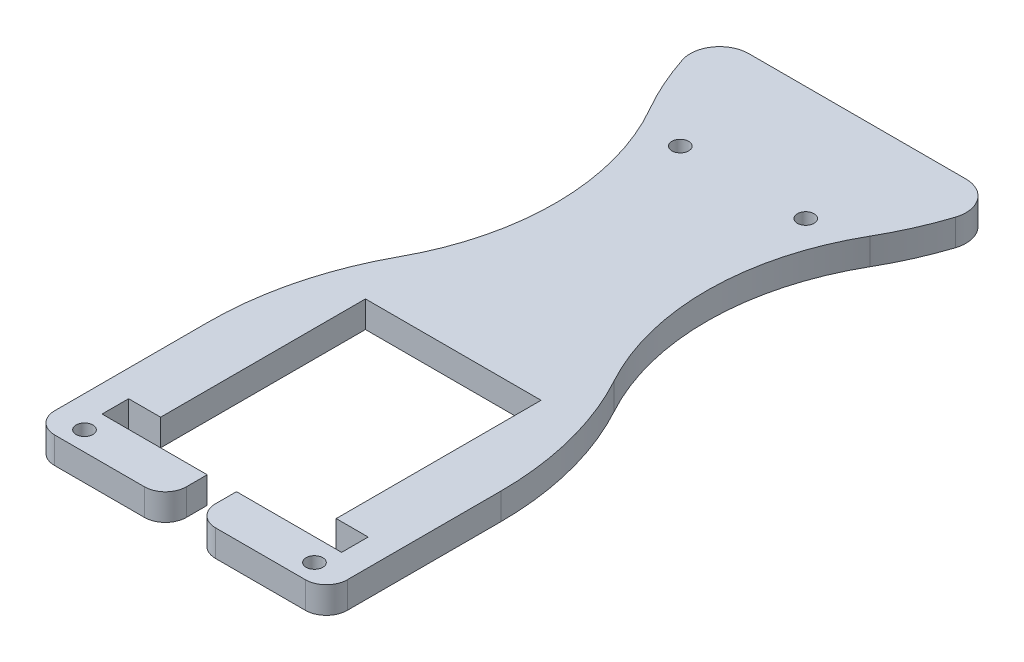
ISO-10303-21;
HEADER;
FILE_DESCRIPTION(('STEP AP214'),'2;1');
FILE_NAME('part.step','',(''),(''),'','','');
FILE_SCHEMA(('AUTOMOTIVE_DESIGN { 1 0 10303 214 1 1 1 1 }'));
ENDSEC;
DATA;
#1=APPLICATION_CONTEXT('core data for automotive mechanical design processes');
#2=APPLICATION_PROTOCOL_DEFINITION('international standard','automotive_design',2000,#1);
#3=PRODUCT_CONTEXT('',#1,'mechanical');
#4=PRODUCT('Part','Part','',(#3));
#5=PRODUCT_RELATED_PRODUCT_CATEGORY('part','',(#4));
#6=PRODUCT_DEFINITION_FORMATION('','',#4);
#7=PRODUCT_DEFINITION_CONTEXT('part definition',#1,'design');
#8=PRODUCT_DEFINITION('design','',#6,#7);
#9=PRODUCT_DEFINITION_SHAPE('','',#8);
#10=(LENGTH_UNIT() NAMED_UNIT(*) SI_UNIT(.MILLI.,.METRE.));
#11=(NAMED_UNIT(*) PLANE_ANGLE_UNIT() SI_UNIT($,.RADIAN.));
#12=(NAMED_UNIT(*) SI_UNIT($,.STERADIAN.) SOLID_ANGLE_UNIT());
#13=UNCERTAINTY_MEASURE_WITH_UNIT(LENGTH_MEASURE(1.E-05),#10,'distance_accuracy_value','');
#14=(GEOMETRIC_REPRESENTATION_CONTEXT(3) GLOBAL_UNCERTAINTY_ASSIGNED_CONTEXT((#13)) GLOBAL_UNIT_ASSIGNED_CONTEXT((#10,
#11,#12)) REPRESENTATION_CONTEXT('',''));
#15=CARTESIAN_POINT('',(0.,0.,0.));
#16=DIRECTION('',(0.,0.,1.));
#17=DIRECTION('',(1.,0.,0.));
#18=AXIS2_PLACEMENT_3D('',#15,#16,#17);
#19=CARTESIAN_POINT('',(35.,3.175,0.));
#20=DIRECTION('',(-1.,0.,0.));
#21=DIRECTION('',(0.,0.,1.));
#22=AXIS2_PLACEMENT_3D('',#19,#20,#21);
#23=PLANE('',#22);
#24=DIRECTION('',(0.,0.,-1.));
#25=VECTOR('',#24,1.);
#26=CARTESIAN_POINT('',(35.,-3.175,0.));
#27=LINE('',#26,#25);
#28=CARTESIAN_POINT('',(35.,-3.175,195.));
#29=VERTEX_POINT('',#28);
#30=CARTESIAN_POINT('',(35.,-3.175,158.290819365853));
#31=VERTEX_POINT('',#30);
#32=EDGE_CURVE('E361',#29,#31,#27,.T.);
#33=ORIENTED_EDGE('',*,*,#32,.T.);
#34=DIRECTION('',(0.,-1.,0.));
#35=VECTOR('',#34,1.);
#36=CARTESIAN_POINT('',(35.,3.175,158.290819365853));
#37=LINE('',#36,#35);
#38=CARTESIAN_POINT('',(35.,3.175,158.290819365853));
#39=VERTEX_POINT('',#38);
#40=EDGE_CURVE('E466',#31,#39,#37,.F.);
#41=ORIENTED_EDGE('',*,*,#40,.T.);
#42=DIRECTION('',(0.,0.,-1.));
#43=VECTOR('',#42,1.);
#44=CARTESIAN_POINT('',(35.,3.175,0.));
#45=LINE('',#44,#43);
#46=CARTESIAN_POINT('',(35.,3.175,195.));
#47=VERTEX_POINT('',#46);
#48=EDGE_CURVE('E366',#47,#39,#45,.T.);
#49=ORIENTED_EDGE('',*,*,#48,.F.);
#50=DIRECTION('',(0.,-1.,0.));
#51=VECTOR('',#50,1.);
#52=CARTESIAN_POINT('',(35.,3.175,195.));
#53=LINE('',#52,#51);
#54=EDGE_CURVE('E426',#47,#29,#53,.T.);
#55=ORIENTED_EDGE('',*,*,#54,.T.);
#56=EDGE_LOOP('',(#33,#41,#49,#55));
#57=FACE_BOUND('',#56,.T.);
#58=ADVANCED_FACE('F41',(#57),#23,.F.);
#59=CARTESIAN_POINT('',(0.,3.175,0.));
#60=DIRECTION('',(0.,1.,0.));
#61=DIRECTION('',(0.,0.,1.));
#62=AXIS2_PLACEMENT_3D('',#59,#60,#61);
#63=PLANE('',#62);
#64=CARTESIAN_POINT('',(-27.4999999999999,3.175,195.35));
#65=DIRECTION('',(0.,1.,0.));
#66=DIRECTION('',(0.,0.,1.));
#67=AXIS2_PLACEMENT_3D('',#64,#65,#66);
#68=CIRCLE('',#67,2.00000000000001);
#69=CARTESIAN_POINT('',(-27.4999999999999,3.175,197.35));
#70=VERTEX_POINT('',#69);
#71=EDGE_CURVE('E532',#70,#70,#68,.T.);
#72=ORIENTED_EDGE('',*,*,#71,.F.);
#73=EDGE_LOOP('',(#72));
#74=FACE_BOUND('',#73,.T.);
#75=CARTESIAN_POINT('',(27.5000000000001,3.175,195.35));
#76=DIRECTION('',(0.,1.,0.));
#77=DIRECTION('',(0.,0.,1.));
#78=AXIS2_PLACEMENT_3D('',#75,#76,#77);
#79=CIRCLE('',#78,2.00000000000001);
#80=CARTESIAN_POINT('',(27.5000000000001,3.175,197.35));
#81=VERTEX_POINT('',#80);
#82=EDGE_CURVE('E557',#81,#81,#79,.T.);
#83=ORIENTED_EDGE('',*,*,#82,.F.);
#84=EDGE_LOOP('',(#83));
#85=FACE_BOUND('',#84,.T.);
#86=CARTESIAN_POINT('',(-14.9999999999999,3.175,65.3500000000001));
#87=DIRECTION('',(0.,1.,0.));
#88=DIRECTION('',(0.,0.,1.));
#89=AXIS2_PLACEMENT_3D('',#86,#87,#88);
#90=CIRCLE('',#89,2.00000000000001);
#91=CARTESIAN_POINT('',(-14.9999999999999,3.175,67.3500000000001));
#92=VERTEX_POINT('',#91);
#93=EDGE_CURVE('E549',#92,#92,#90,.T.);
#94=ORIENTED_EDGE('',*,*,#93,.F.);
#95=EDGE_LOOP('',(#94));
#96=FACE_BOUND('',#95,.T.);
#97=CARTESIAN_POINT('',(15.0000000000001,3.175,65.3500000000001));
#98=DIRECTION('',(0.,1.,0.));
#99=DIRECTION('',(0.,0.,1.));
#100=AXIS2_PLACEMENT_3D('',#97,#98,#99);
#101=CIRCLE('',#100,2.00000000000001);
#102=CARTESIAN_POINT('',(15.0000000000001,3.175,67.3500000000001));
#103=VERTEX_POINT('',#102);
#104=EDGE_CURVE('E262',#103,#103,#101,.T.);
#105=ORIENTED_EDGE('',*,*,#104,.F.);
#106=EDGE_LOOP('',(#105));
#107=FACE_BOUND('',#106,.T.);
#108=CARTESIAN_POINT('',(-39.608915366642,3.175,23.5255484451654));
#109=DIRECTION('',(0.,1.,0.));
#110=DIRECTION('',(0.,0.,1.));
#111=AXIS2_PLACEMENT_3D('',#108,#109,#110);
#112=CIRCLE('',#111,76.);
#113=CARTESIAN_POINT('',(26.311818964941,3.175,61.3469284462291));
#114=VERTEX_POINT('',#113);
#115=CARTESIAN_POINT('',(32.6166665782042,3.175,47.1785675490412));
#116=VERTEX_POINT('',#115);
#117=EDGE_CURVE('E450',#114,#116,#112,.T.);
#118=ORIENTED_EDGE('',*,*,#117,.T.);
#119=CARTESIAN_POINT('',(25.964310346442,3.175,45.));
#120=DIRECTION('',(0.,1.,0.));
#121=DIRECTION('',(0.,0.,1.));
#122=AXIS2_PLACEMENT_3D('',#119,#120,#121);
#123=CIRCLE('',#122,7.);
#124=CARTESIAN_POINT('',(25.964310346442,3.175,38.));
#125=VERTEX_POINT('',#124);
#126=EDGE_CURVE('E487',#116,#125,#123,.T.);
#127=ORIENTED_EDGE('',*,*,#126,.T.);
#128=DIRECTION('',(-1.,0.,0.));
#129=VECTOR('',#128,1.);
#130=CARTESIAN_POINT('',(0.,3.175,38.));
#131=LINE('',#130,#129);
#132=CARTESIAN_POINT('',(-25.9643103464421,3.175,38.));
#133=VERTEX_POINT('',#132);
#134=EDGE_CURVE('E324',#125,#133,#131,.T.);
#135=ORIENTED_EDGE('',*,*,#134,.T.);
#136=CARTESIAN_POINT('',(-25.964310346442,3.175,45.));
#137=DIRECTION('',(0.,1.,0.));
#138=DIRECTION('',(0.,0.,1.));
#139=AXIS2_PLACEMENT_3D('',#136,#137,#138);
#140=CIRCLE('',#139,7.);
#141=CARTESIAN_POINT('',(-32.6166665782042,3.175,47.1785675490412));
#142=VERTEX_POINT('',#141);
#143=EDGE_CURVE('E484',#133,#142,#140,.T.);
#144=ORIENTED_EDGE('',*,*,#143,.T.);
#145=CARTESIAN_POINT('',(39.608915366642,3.175,23.5255484451655));
#146=DIRECTION('',(0.,1.,0.));
#147=DIRECTION('',(0.,0.,1.));
#148=AXIS2_PLACEMENT_3D('',#145,#146,#147);
#149=CIRCLE('',#148,76.);
#150=CARTESIAN_POINT('',(-26.311818964941,3.175,61.3469284462291));
#151=VERTEX_POINT('',#150);
#152=EDGE_CURVE('E444',#142,#151,#149,.T.);
#153=ORIENTED_EDGE('',*,*,#152,.T.);
#154=CARTESIAN_POINT('',(-80.,3.175,92.15));
#155=DIRECTION('',(0.,1.,0.));
#156=DIRECTION('',(0.,0.,1.));
#157=AXIS2_PLACEMENT_3D('',#154,#155,#156);
#158=CIRCLE('',#157,61.8970920156997);
#159=CARTESIAN_POINT('',(-25.6874106304796,3.175,121.838257543646));
#160=VERTEX_POINT('',#159);
#161=EDGE_CURVE('E528',#160,#151,#158,.T.);
#162=ORIENTED_EDGE('',*,*,#161,.F.);
#163=CARTESIAN_POINT('',(41.,3.175,158.290819365853));
#164=DIRECTION('',(0.,1.,0.));
#165=DIRECTION('',(0.,0.,1.));
#166=AXIS2_PLACEMENT_3D('',#163,#164,#165);
#167=CIRCLE('',#166,76.);
#168=CARTESIAN_POINT('',(-35.,3.175,158.290819365853));
#169=VERTEX_POINT('',#168);
#170=EDGE_CURVE('E441',#160,#169,#167,.T.);
#171=ORIENTED_EDGE('',*,*,#170,.T.);
#172=DIRECTION('',(0.,0.,1.));
#173=VECTOR('',#172,1.);
#174=CARTESIAN_POINT('',(-35.,3.175,0.));
#175=LINE('',#174,#173);
#176=CARTESIAN_POINT('',(-35.,3.175,195.));
#177=VERTEX_POINT('',#176);
#178=EDGE_CURVE('E357',#169,#177,#175,.T.);
#179=ORIENTED_EDGE('',*,*,#178,.T.);
#180=CARTESIAN_POINT('',(-30.,3.175,195.));
#181=DIRECTION('',(0.,1.,0.));
#182=DIRECTION('',(0.,0.,1.));
#183=AXIS2_PLACEMENT_3D('',#180,#181,#182);
#184=CIRCLE('',#183,5.);
#185=CARTESIAN_POINT('',(-30.,3.175,200.));
#186=VERTEX_POINT('',#185);
#187=EDGE_CURVE('E384',#177,#186,#184,.T.);
#188=ORIENTED_EDGE('',*,*,#187,.T.);
#189=DIRECTION('',(1.,0.,0.));
#190=VECTOR('',#189,1.);
#191=CARTESIAN_POINT('',(0.,3.175,200.));
#192=LINE('',#191,#190);
#193=CARTESIAN_POINT('',(-8.5,3.175,200.));
#194=VERTEX_POINT('',#193);
#195=EDGE_CURVE('E362',#186,#194,#192,.T.);
#196=ORIENTED_EDGE('',*,*,#195,.T.);
#197=CARTESIAN_POINT('',(-8.5,3.175,195.));
#198=DIRECTION('',(0.,1.,0.));
#199=DIRECTION('',(0.,0.,1.));
#200=AXIS2_PLACEMENT_3D('',#197,#198,#199);
#201=CIRCLE('',#200,5.);
#202=CARTESIAN_POINT('',(-3.5,3.175,195.));
#203=VERTEX_POINT('',#202);
#204=EDGE_CURVE('E390',#194,#203,#201,.T.);
#205=ORIENTED_EDGE('',*,*,#204,.T.);
#206=DIRECTION('',(0.,0.,-1.));
#207=VECTOR('',#206,1.);
#208=CARTESIAN_POINT('',(-3.5,3.175,0.));
#209=LINE('',#208,#207);
#210=CARTESIAN_POINT('',(-3.5,3.175,190.));
#211=VERTEX_POINT('',#210);
#212=EDGE_CURVE('E303',#203,#211,#209,.T.);
#213=ORIENTED_EDGE('',*,*,#212,.T.);
#214=DIRECTION('',(-1.,0.,0.));
#215=VECTOR('',#214,1.);
#216=CARTESIAN_POINT('',(0.,3.175,190.));
#217=LINE('',#216,#215);
#218=CARTESIAN_POINT('',(-28.65,3.175,190.));
#219=VERTEX_POINT('',#218);
#220=EDGE_CURVE('E299',#211,#219,#217,.T.);
#221=ORIENTED_EDGE('',*,*,#220,.T.);
#222=DIRECTION('',(0.,0.,-1.));
#223=VECTOR('',#222,1.);
#224=CARTESIAN_POINT('',(-28.65,3.175,0.));
#225=LINE('',#224,#223);
#226=CARTESIAN_POINT('',(-28.65,3.175,183.65));
#227=VERTEX_POINT('',#226);
#228=EDGE_CURVE('E295',#219,#227,#225,.T.);
#229=ORIENTED_EDGE('',*,*,#228,.T.);
#230=DIRECTION('',(-1.,0.,0.));
#231=VECTOR('',#230,1.);
#232=CARTESIAN_POINT('',(0.,3.175,183.65));
#233=LINE('',#232,#231);
#234=CARTESIAN_POINT('',(-21.,3.175,183.65));
#235=VERTEX_POINT('',#234);
#236=EDGE_CURVE('E291',#235,#227,#233,.T.);
#237=ORIENTED_EDGE('',*,*,#236,.F.);
#238=DIRECTION('',(0.,0.,-1.));
#239=VECTOR('',#238,1.);
#240=CARTESIAN_POINT('',(-21.,3.175,0.));
#241=LINE('',#240,#239);
#242=CARTESIAN_POINT('',(-21.,3.175,134.65));
#243=VERTEX_POINT('',#242);
#244=EDGE_CURVE('E234',#235,#243,#241,.T.);
#245=ORIENTED_EDGE('',*,*,#244,.T.);
#246=DIRECTION('',(-1.,0.,0.));
#247=VECTOR('',#246,1.);
#248=CARTESIAN_POINT('',(0.,3.175,134.65));
#249=LINE('',#248,#247);
#250=CARTESIAN_POINT('',(21.,3.175,134.65));
#251=VERTEX_POINT('',#250);
#252=EDGE_CURVE('E255',#251,#243,#249,.T.);
#253=ORIENTED_EDGE('',*,*,#252,.F.);
#254=DIRECTION('',(0.,0.,-1.));
#255=VECTOR('',#254,1.);
#256=CARTESIAN_POINT('',(21.,3.175,0.));
#257=LINE('',#256,#255);
#258=CARTESIAN_POINT('',(21.,3.175,183.65));
#259=VERTEX_POINT('',#258);
#260=EDGE_CURVE('E259',#259,#251,#257,.T.);
#261=ORIENTED_EDGE('',*,*,#260,.F.);
#262=DIRECTION('',(1.,0.,0.));
#263=VECTOR('',#262,1.);
#264=CARTESIAN_POINT('',(-6.66315223766046E-13,3.175,183.65));
#265=LINE('',#264,#263);
#266=CARTESIAN_POINT('',(28.65,3.175,183.65));
#267=VERTEX_POINT('',#266);
#268=EDGE_CURVE('E314',#259,#267,#265,.T.);
#269=ORIENTED_EDGE('',*,*,#268,.T.);
#270=DIRECTION('',(0.,0.,-1.));
#271=VECTOR('',#270,1.);
#272=CARTESIAN_POINT('',(28.65,3.175,0.));
#273=LINE('',#272,#271);
#274=CARTESIAN_POINT('',(28.65,3.175,190.));
#275=VERTEX_POINT('',#274);
#276=EDGE_CURVE('E310',#275,#267,#273,.T.);
#277=ORIENTED_EDGE('',*,*,#276,.F.);
#278=CARTESIAN_POINT('',(3.5,3.175,190.));
#279=VERTEX_POINT('',#278);
#280=EDGE_CURVE('E304',#275,#279,#217,.T.);
#281=ORIENTED_EDGE('',*,*,#280,.T.);
#282=DIRECTION('',(0.,0.,-1.));
#283=VECTOR('',#282,1.);
#284=CARTESIAN_POINT('',(3.5,3.175,0.));
#285=LINE('',#284,#283);
#286=CARTESIAN_POINT('',(3.5,3.175,195.));
#287=VERTEX_POINT('',#286);
#288=EDGE_CURVE('E307',#287,#279,#285,.T.);
#289=ORIENTED_EDGE('',*,*,#288,.F.);
#290=CARTESIAN_POINT('',(8.5,3.175,195.));
#291=DIRECTION('',(0.,1.,0.));
#292=DIRECTION('',(0.,0.,1.));
#293=AXIS2_PLACEMENT_3D('',#290,#291,#292);
#294=CIRCLE('',#293,5.);
#295=CARTESIAN_POINT('',(8.5,3.175,200.));
#296=VERTEX_POINT('',#295);
#297=EDGE_CURVE('E393',#287,#296,#294,.T.);
#298=ORIENTED_EDGE('',*,*,#297,.T.);
#299=CARTESIAN_POINT('',(30.,3.175,200.));
#300=VERTEX_POINT('',#299);
#301=EDGE_CURVE('E360',#296,#300,#192,.T.);
#302=ORIENTED_EDGE('',*,*,#301,.T.);
#303=CARTESIAN_POINT('',(30.,3.175,195.));
#304=DIRECTION('',(0.,1.,0.));
#305=DIRECTION('',(0.,0.,1.));
#306=AXIS2_PLACEMENT_3D('',#303,#304,#305);
#307=CIRCLE('',#306,5.);
#308=EDGE_CURVE('E387',#300,#47,#307,.T.);
#309=ORIENTED_EDGE('',*,*,#308,.T.);
#310=ORIENTED_EDGE('',*,*,#48,.T.);
#311=CARTESIAN_POINT('',(-41.,3.175,158.290819365853));
#312=DIRECTION('',(0.,1.,0.));
#313=DIRECTION('',(0.,0.,1.));
#314=AXIS2_PLACEMENT_3D('',#311,#312,#313);
#315=CIRCLE('',#314,76.);
#316=CARTESIAN_POINT('',(25.6874106304796,3.175,121.838257543646));
#317=VERTEX_POINT('',#316);
#318=EDGE_CURVE('E447',#39,#317,#315,.T.);
#319=ORIENTED_EDGE('',*,*,#318,.T.);
#320=CARTESIAN_POINT('',(80.,3.175,92.15));
#321=DIRECTION('',(0.,-1.,0.));
#322=DIRECTION('',(0.,0.,1.));
#323=AXIS2_PLACEMENT_3D('',#320,#321,#322);
#324=CIRCLE('',#323,61.8970920156997);
#325=EDGE_CURVE('E542',#317,#114,#324,.T.);
#326=ORIENTED_EDGE('',*,*,#325,.T.);
#327=EDGE_LOOP('',(#118,#127,#135,#144,#153,#162,#171,#179,#188,#196,#205,#213,#221,#229,#237,
#245,#253,#261,#269,#277,#281,#289,#298,#302,#309,#310,#319,#326));
#328=FACE_BOUND('',#327,.T.);
#329=ADVANCED_FACE('F512',(#74,#85,#96,#107,#328),#63,.T.);
#330=CARTESIAN_POINT('',(0.,-3.175,0.));
#331=DIRECTION('',(0.,1.,0.));
#332=DIRECTION('',(0.,0.,1.));
#333=AXIS2_PLACEMENT_3D('',#330,#331,#332);
#334=PLANE('',#333);
#335=CARTESIAN_POINT('',(15.0000000000001,-3.175,65.3500000000001));
#336=DIRECTION('',(0.,1.,0.));
#337=DIRECTION('',(0.,0.,1.));
#338=AXIS2_PLACEMENT_3D('',#335,#336,#337);
#339=CIRCLE('',#338,2.00000000000001);
#340=CARTESIAN_POINT('',(15.0000000000001,-3.175,67.3500000000001));
#341=VERTEX_POINT('',#340);
#342=EDGE_CURVE('E292',#341,#341,#339,.T.);
#343=ORIENTED_EDGE('',*,*,#342,.T.);
#344=EDGE_LOOP('',(#343));
#345=FACE_BOUND('',#344,.T.);
#346=CARTESIAN_POINT('',(-14.9999999999999,-3.175,65.3500000000001));
#347=DIRECTION('',(0.,1.,0.));
#348=DIRECTION('',(0.,0.,1.));
#349=AXIS2_PLACEMENT_3D('',#346,#347,#348);
#350=CIRCLE('',#349,2.00000000000001);
#351=CARTESIAN_POINT('',(-14.9999999999999,-3.175,67.3500000000001));
#352=VERTEX_POINT('',#351);
#353=EDGE_CURVE('E545',#352,#352,#350,.T.);
#354=ORIENTED_EDGE('',*,*,#353,.T.);
#355=EDGE_LOOP('',(#354));
#356=FACE_BOUND('',#355,.T.);
#357=CARTESIAN_POINT('',(27.5000000000001,-3.175,195.35));
#358=DIRECTION('',(0.,1.,0.));
#359=DIRECTION('',(0.,0.,1.));
#360=AXIS2_PLACEMENT_3D('',#357,#358,#359);
#361=CIRCLE('',#360,2.00000000000001);
#362=CARTESIAN_POINT('',(27.5000000000001,-3.175,197.35));
#363=VERTEX_POINT('',#362);
#364=EDGE_CURVE('E553',#363,#363,#361,.T.);
#365=ORIENTED_EDGE('',*,*,#364,.T.);
#366=EDGE_LOOP('',(#365));
#367=FACE_BOUND('',#366,.T.);
#368=CARTESIAN_POINT('',(-27.4999999999999,-3.175,195.35));
#369=DIRECTION('',(0.,1.,0.));
#370=DIRECTION('',(0.,0.,1.));
#371=AXIS2_PLACEMENT_3D('',#368,#369,#370);
#372=CIRCLE('',#371,2.00000000000001);
#373=CARTESIAN_POINT('',(-27.4999999999999,-3.175,197.35));
#374=VERTEX_POINT('',#373);
#375=EDGE_CURVE('E537',#374,#374,#372,.T.);
#376=ORIENTED_EDGE('',*,*,#375,.T.);
#377=EDGE_LOOP('',(#376));
#378=FACE_BOUND('',#377,.T.);
#379=DIRECTION('',(-1.,0.,0.));
#380=VECTOR('',#379,1.);
#381=CARTESIAN_POINT('',(0.,-3.175,38.));
#382=LINE('',#381,#380);
#383=CARTESIAN_POINT('',(25.964310346442,-3.175,38.));
#384=VERTEX_POINT('',#383);
#385=CARTESIAN_POINT('',(-25.9643103464421,-3.175,38.));
#386=VERTEX_POINT('',#385);
#387=EDGE_CURVE('E350',#384,#386,#382,.T.);
#388=ORIENTED_EDGE('',*,*,#387,.F.);
#389=CARTESIAN_POINT('',(25.964310346442,-3.175,45.));
#390=DIRECTION('',(0.,1.,0.));
#391=DIRECTION('',(0.,0.,1.));
#392=AXIS2_PLACEMENT_3D('',#389,#390,#391);
#393=CIRCLE('',#392,7.);
#394=CARTESIAN_POINT('',(32.6166665782042,-3.175,47.1785675490412));
#395=VERTEX_POINT('',#394);
#396=EDGE_CURVE('E50',#384,#395,#393,.F.);
#397=ORIENTED_EDGE('',*,*,#396,.T.);
#398=CARTESIAN_POINT('',(-39.608915366642,-3.175,23.5255484451654));
#399=DIRECTION('',(0.,1.,0.));
#400=DIRECTION('',(0.,0.,1.));
#401=AXIS2_PLACEMENT_3D('',#398,#399,#400);
#402=CIRCLE('',#401,76.);
#403=CARTESIAN_POINT('',(26.311818964941,-3.175,61.3469284462291));
#404=VERTEX_POINT('',#403);
#405=EDGE_CURVE('E463',#395,#404,#402,.F.);
#406=ORIENTED_EDGE('',*,*,#405,.T.);
#407=CARTESIAN_POINT('',(80.,-3.175,92.15));
#408=DIRECTION('',(0.,-1.,0.));
#409=DIRECTION('',(0.,0.,1.));
#410=AXIS2_PLACEMENT_3D('',#407,#408,#409);
#411=CIRCLE('',#410,61.8970920156997);
#412=CARTESIAN_POINT('',(25.6874106304796,-3.175,121.838257543646));
#413=VERTEX_POINT('',#412);
#414=EDGE_CURVE('E539',#413,#404,#411,.T.);
#415=ORIENTED_EDGE('',*,*,#414,.F.);
#416=CARTESIAN_POINT('',(-41.,-3.175,158.290819365853));
#417=DIRECTION('',(0.,1.,0.));
#418=DIRECTION('',(0.,0.,1.));
#419=AXIS2_PLACEMENT_3D('',#416,#417,#418);
#420=CIRCLE('',#419,76.);
#421=EDGE_CURVE('E460',#413,#31,#420,.F.);
#422=ORIENTED_EDGE('',*,*,#421,.T.);
#423=ORIENTED_EDGE('',*,*,#32,.F.);
#424=CARTESIAN_POINT('',(30.,-3.175,195.));
#425=DIRECTION('',(0.,1.,0.));
#426=DIRECTION('',(0.,0.,1.));
#427=AXIS2_PLACEMENT_3D('',#424,#425,#426);
#428=CIRCLE('',#427,5.);
#429=CARTESIAN_POINT('',(30.,-3.175,200.));
#430=VERTEX_POINT('',#429);
#431=EDGE_CURVE('E406',#29,#430,#428,.F.);
#432=ORIENTED_EDGE('',*,*,#431,.T.);
#433=DIRECTION('',(1.,0.,0.));
#434=VECTOR('',#433,1.);
#435=CARTESIAN_POINT('',(0.,-3.175,200.));
#436=LINE('',#435,#434);
#437=CARTESIAN_POINT('',(8.5,-3.175,200.));
#438=VERTEX_POINT('',#437);
#439=EDGE_CURVE('E373',#438,#430,#436,.T.);
#440=ORIENTED_EDGE('',*,*,#439,.F.);
#441=CARTESIAN_POINT('',(8.5,-3.175,195.));
#442=DIRECTION('',(0.,1.,0.));
#443=DIRECTION('',(0.,0.,1.));
#444=AXIS2_PLACEMENT_3D('',#441,#442,#443);
#445=CIRCLE('',#444,5.);
#446=CARTESIAN_POINT('',(3.5,-3.175,195.));
#447=VERTEX_POINT('',#446);
#448=EDGE_CURVE('E412',#438,#447,#445,.F.);
#449=ORIENTED_EDGE('',*,*,#448,.T.);
#450=DIRECTION('',(0.,0.,-1.));
#451=VECTOR('',#450,1.);
#452=CARTESIAN_POINT('',(3.5,-3.175,0.));
#453=LINE('',#452,#451);
#454=CARTESIAN_POINT('',(3.5,-3.175,190.));
#455=VERTEX_POINT('',#454);
#456=EDGE_CURVE('E274',#447,#455,#453,.T.);
#457=ORIENTED_EDGE('',*,*,#456,.T.);
#458=DIRECTION('',(-1.,0.,0.));
#459=VECTOR('',#458,1.);
#460=CARTESIAN_POINT('',(0.,-3.175,190.));
#461=LINE('',#460,#459);
#462=CARTESIAN_POINT('',(28.65,-3.175,190.));
#463=VERTEX_POINT('',#462);
#464=EDGE_CURVE('E271',#463,#455,#461,.T.);
#465=ORIENTED_EDGE('',*,*,#464,.F.);
#466=DIRECTION('',(0.,0.,-1.));
#467=VECTOR('',#466,1.);
#468=CARTESIAN_POINT('',(28.65,-3.175,0.));
#469=LINE('',#468,#467);
#470=CARTESIAN_POINT('',(28.65,-3.175,183.65));
#471=VERTEX_POINT('',#470);
#472=EDGE_CURVE('E277',#463,#471,#469,.T.);
#473=ORIENTED_EDGE('',*,*,#472,.T.);
#474=DIRECTION('',(1.,0.,0.));
#475=VECTOR('',#474,1.);
#476=CARTESIAN_POINT('',(-6.66315223766046E-13,-3.175,183.65));
#477=LINE('',#476,#475);
#478=CARTESIAN_POINT('',(21.,-3.175,183.65));
#479=VERTEX_POINT('',#478);
#480=EDGE_CURVE('E281',#479,#471,#477,.T.);
#481=ORIENTED_EDGE('',*,*,#480,.F.);
#482=DIRECTION('',(0.,0.,-1.));
#483=VECTOR('',#482,1.);
#484=CARTESIAN_POINT('',(21.,-3.175,0.));
#485=LINE('',#484,#483);
#486=CARTESIAN_POINT('',(21.,-3.175,134.65));
#487=VERTEX_POINT('',#486);
#488=EDGE_CURVE('E284',#479,#487,#485,.T.);
#489=ORIENTED_EDGE('',*,*,#488,.T.);
#490=DIRECTION('',(-1.,0.,0.));
#491=VECTOR('',#490,1.);
#492=CARTESIAN_POINT('',(0.,-3.175,134.65));
#493=LINE('',#492,#491);
#494=CARTESIAN_POINT('',(-21.,-3.175,134.65));
#495=VERTEX_POINT('',#494);
#496=EDGE_CURVE('E240',#487,#495,#493,.T.);
#497=ORIENTED_EDGE('',*,*,#496,.T.);
#498=DIRECTION('',(0.,0.,-1.));
#499=VECTOR('',#498,1.);
#500=CARTESIAN_POINT('',(-21.,-3.175,0.));
#501=LINE('',#500,#499);
#502=CARTESIAN_POINT('',(-21.,-3.175,183.65));
#503=VERTEX_POINT('',#502);
#504=EDGE_CURVE('E231',#503,#495,#501,.T.);
#505=ORIENTED_EDGE('',*,*,#504,.F.);
#506=DIRECTION('',(-1.,0.,0.));
#507=VECTOR('',#506,1.);
#508=CARTESIAN_POINT('',(0.,-3.175,183.65));
#509=LINE('',#508,#507);
#510=CARTESIAN_POINT('',(-28.65,-3.175,183.65));
#511=VERTEX_POINT('',#510);
#512=EDGE_CURVE('E244',#503,#511,#509,.T.);
#513=ORIENTED_EDGE('',*,*,#512,.T.);
#514=DIRECTION('',(0.,0.,-1.));
#515=VECTOR('',#514,1.);
#516=CARTESIAN_POINT('',(-28.65,-3.175,0.));
#517=LINE('',#516,#515);
#518=CARTESIAN_POINT('',(-28.65,-3.175,190.));
#519=VERTEX_POINT('',#518);
#520=EDGE_CURVE('E248',#519,#511,#517,.T.);
#521=ORIENTED_EDGE('',*,*,#520,.F.);
#522=CARTESIAN_POINT('',(-3.5,-3.175,190.));
#523=VERTEX_POINT('',#522);
#524=EDGE_CURVE('E267',#523,#519,#461,.T.);
#525=ORIENTED_EDGE('',*,*,#524,.F.);
#526=DIRECTION('',(0.,0.,-1.));
#527=VECTOR('',#526,1.);
#528=CARTESIAN_POINT('',(-3.5,-3.175,0.));
#529=LINE('',#528,#527);
#530=CARTESIAN_POINT('',(-3.5,-3.175,195.));
#531=VERTEX_POINT('',#530);
#532=EDGE_CURVE('E270',#531,#523,#529,.T.);
#533=ORIENTED_EDGE('',*,*,#532,.F.);
#534=CARTESIAN_POINT('',(-8.5,-3.175,195.));
#535=DIRECTION('',(0.,1.,0.));
#536=DIRECTION('',(0.,0.,1.));
#537=AXIS2_PLACEMENT_3D('',#534,#535,#536);
#538=CIRCLE('',#537,5.);
#539=CARTESIAN_POINT('',(-8.5,-3.175,200.));
#540=VERTEX_POINT('',#539);
#541=EDGE_CURVE('E409',#531,#540,#538,.F.);
#542=ORIENTED_EDGE('',*,*,#541,.T.);
#543=CARTESIAN_POINT('',(-30.,-3.175,200.));
#544=VERTEX_POINT('',#543);
#545=EDGE_CURVE('E374',#544,#540,#436,.T.);
#546=ORIENTED_EDGE('',*,*,#545,.F.);
#547=CARTESIAN_POINT('',(-30.,-3.175,195.));
#548=DIRECTION('',(0.,1.,0.));
#549=DIRECTION('',(0.,0.,1.));
#550=AXIS2_PLACEMENT_3D('',#547,#548,#549);
#551=CIRCLE('',#550,5.);
#552=CARTESIAN_POINT('',(-35.,-3.175,195.));
#553=VERTEX_POINT('',#552);
#554=EDGE_CURVE('E402',#544,#553,#551,.F.);
#555=ORIENTED_EDGE('',*,*,#554,.T.);
#556=DIRECTION('',(0.,0.,1.));
#557=VECTOR('',#556,1.);
#558=CARTESIAN_POINT('',(-35.,-3.175,0.));
#559=LINE('',#558,#557);
#560=CARTESIAN_POINT('',(-35.,-3.175,158.290819365853));
#561=VERTEX_POINT('',#560);
#562=EDGE_CURVE('E353',#561,#553,#559,.T.);
#563=ORIENTED_EDGE('',*,*,#562,.F.);
#564=CARTESIAN_POINT('',(41.,-3.175,158.290819365853));
#565=DIRECTION('',(0.,1.,0.));
#566=DIRECTION('',(0.,0.,1.));
#567=AXIS2_PLACEMENT_3D('',#564,#565,#566);
#568=CIRCLE('',#567,76.);
#569=CARTESIAN_POINT('',(-25.6874106304796,-3.175,121.838257543646));
#570=VERTEX_POINT('',#569);
#571=EDGE_CURVE('E454',#561,#570,#568,.F.);
#572=ORIENTED_EDGE('',*,*,#571,.T.);
#573=CARTESIAN_POINT('',(-80.,-3.175,92.15));
#574=DIRECTION('',(0.,1.,0.));
#575=DIRECTION('',(0.,0.,1.));
#576=AXIS2_PLACEMENT_3D('',#573,#574,#575);
#577=CIRCLE('',#576,61.8970920156997);
#578=CARTESIAN_POINT('',(-26.311818964941,-3.175,61.3469284462291));
#579=VERTEX_POINT('',#578);
#580=EDGE_CURVE('E526',#570,#579,#577,.T.);
#581=ORIENTED_EDGE('',*,*,#580,.T.);
#582=CARTESIAN_POINT('',(39.608915366642,-3.175,23.5255484451655));
#583=DIRECTION('',(0.,1.,0.));
#584=DIRECTION('',(0.,0.,1.));
#585=AXIS2_PLACEMENT_3D('',#582,#583,#584);
#586=CIRCLE('',#585,76.);
#587=CARTESIAN_POINT('',(-32.6166665782042,-3.175,47.1785675490412));
#588=VERTEX_POINT('',#587);
#589=EDGE_CURVE('E457',#579,#588,#586,.F.);
#590=ORIENTED_EDGE('',*,*,#589,.T.);
#591=CARTESIAN_POINT('',(-25.964310346442,-3.175,45.));
#592=DIRECTION('',(0.,1.,0.));
#593=DIRECTION('',(0.,0.,1.));
#594=AXIS2_PLACEMENT_3D('',#591,#592,#593);
#595=CIRCLE('',#594,7.);
#596=EDGE_CURVE('E62',#588,#386,#595,.F.);
#597=ORIENTED_EDGE('',*,*,#596,.T.);
#598=EDGE_LOOP('',(#388,#397,#406,#415,#422,#423,#432,#440,#449,#457,#465,#473,#481,#489,#497,
#505,#513,#521,#525,#533,#542,#546,#555,#563,#572,#581,#590,#597));
#599=FACE_BOUND('',#598,.T.);
#600=ADVANCED_FACE('F251',(#345,#356,#367,#378,#599),#334,.F.);
#601=CARTESIAN_POINT('',(0.,3.175,200.));
#602=DIRECTION('',(0.,0.,-1.));
#603=DIRECTION('',(-1.,0.,0.));
#604=AXIS2_PLACEMENT_3D('',#601,#602,#603);
#605=PLANE('',#604);
#606=ORIENTED_EDGE('',*,*,#545,.T.);
#607=DIRECTION('',(0.,1.,0.));
#608=VECTOR('',#607,1.);
#609=CARTESIAN_POINT('',(-8.5,3.175,200.));
#610=LINE('',#609,#608);
#611=EDGE_CURVE('E419',#540,#194,#610,.T.);
#612=ORIENTED_EDGE('',*,*,#611,.T.);
#613=ORIENTED_EDGE('',*,*,#195,.F.);
#614=DIRECTION('',(0.,-1.,0.));
#615=VECTOR('',#614,1.);
#616=CARTESIAN_POINT('',(-30.,3.175,200.));
#617=LINE('',#616,#615);
#618=EDGE_CURVE('E415',#186,#544,#617,.T.);
#619=ORIENTED_EDGE('',*,*,#618,.T.);
#620=EDGE_LOOP('',(#606,#612,#613,#619));
#621=FACE_BOUND('',#620,.T.);
#622=ADVANCED_FACE('F580',(#621),#605,.F.);
#623=CARTESIAN_POINT('',(-35.,3.175,0.));
#624=DIRECTION('',(1.,0.,0.));
#625=DIRECTION('',(0.,0.,-1.));
#626=AXIS2_PLACEMENT_3D('',#623,#624,#625);
#627=PLANE('',#626);
#628=ORIENTED_EDGE('',*,*,#178,.F.);
#629=DIRECTION('',(0.,1.,0.));
#630=VECTOR('',#629,1.);
#631=CARTESIAN_POINT('',(-35.,3.175,158.290819365853));
#632=LINE('',#631,#630);
#633=EDGE_CURVE('E477',#169,#561,#632,.F.);
#634=ORIENTED_EDGE('',*,*,#633,.T.);
#635=ORIENTED_EDGE('',*,*,#562,.T.);
#636=DIRECTION('',(0.,-1.,0.));
#637=VECTOR('',#636,1.);
#638=CARTESIAN_POINT('',(-35.,3.175,195.));
#639=LINE('',#638,#637);
#640=EDGE_CURVE('E430',#553,#177,#639,.F.);
#641=ORIENTED_EDGE('',*,*,#640,.T.);
#642=EDGE_LOOP('',(#628,#634,#635,#641));
#643=FACE_BOUND('',#642,.T.);
#644=ADVANCED_FACE('F592',(#643),#627,.F.);
#645=ORIENTED_EDGE('',*,*,#301,.F.);
#646=DIRECTION('',(0.,1.,0.));
#647=VECTOR('',#646,1.);
#648=CARTESIAN_POINT('',(8.5,3.175,200.));
#649=LINE('',#648,#647);
#650=EDGE_CURVE('E399',#296,#438,#649,.F.);
#651=ORIENTED_EDGE('',*,*,#650,.T.);
#652=ORIENTED_EDGE('',*,*,#439,.T.);
#653=DIRECTION('',(0.,-1.,0.));
#654=VECTOR('',#653,1.);
#655=CARTESIAN_POINT('',(30.,3.175,200.));
#656=LINE('',#655,#654);
#657=EDGE_CURVE('E396',#430,#300,#656,.F.);
#658=ORIENTED_EDGE('',*,*,#657,.T.);
#659=EDGE_LOOP('',(#645,#651,#652,#658));
#660=FACE_BOUND('',#659,.T.);
#661=ADVANCED_FACE('F589',(#660),#605,.F.);
#662=CARTESIAN_POINT('',(0.,-3.175,38.));
#663=DIRECTION('',(0.,0.,-1.));
#664=DIRECTION('',(-1.,0.,0.));
#665=AXIS2_PLACEMENT_3D('',#662,#663,#664);
#666=PLANE('',#665);
#667=ORIENTED_EDGE('',*,*,#134,.F.);
#668=DIRECTION('',(0.,1.,0.));
#669=VECTOR('',#668,1.);
#670=CARTESIAN_POINT('',(25.964310346442,-3.175,38.));
#671=LINE('',#670,#669);
#672=EDGE_CURVE('E494',#125,#384,#671,.F.);
#673=ORIENTED_EDGE('',*,*,#672,.T.);
#674=ORIENTED_EDGE('',*,*,#387,.T.);
#675=DIRECTION('',(0.,1.,0.));
#676=VECTOR('',#675,1.);
#677=CARTESIAN_POINT('',(-25.9643103464421,-3.175,38.));
#678=LINE('',#677,#676);
#679=EDGE_CURVE('E490',#386,#133,#678,.T.);
#680=ORIENTED_EDGE('',*,*,#679,.T.);
#681=EDGE_LOOP('',(#667,#673,#674,#680));
#682=FACE_BOUND('',#681,.T.);
#683=ADVANCED_FACE('F515',(#682),#666,.T.);
#684=CARTESIAN_POINT('',(-21.,-3.175,0.));
#685=DIRECTION('',(1.,0.,0.));
#686=DIRECTION('',(0.,0.,-1.));
#687=AXIS2_PLACEMENT_3D('',#684,#685,#686);
#688=PLANE('',#687);
#689=ORIENTED_EDGE('',*,*,#244,.F.);
#690=DIRECTION('',(0.,1.,0.));
#691=VECTOR('',#690,1.);
#692=CARTESIAN_POINT('',(-21.,-3.175,183.65));
#693=LINE('',#692,#691);
#694=EDGE_CURVE('E227',#503,#235,#693,.T.);
#695=ORIENTED_EDGE('',*,*,#694,.F.);
#696=ORIENTED_EDGE('',*,*,#504,.T.);
#697=DIRECTION('',(0.,1.,0.));
#698=VECTOR('',#697,1.);
#699=CARTESIAN_POINT('',(-21.,-3.175,134.65));
#700=LINE('',#699,#698);
#701=EDGE_CURVE('E321',#495,#243,#700,.T.);
#702=ORIENTED_EDGE('',*,*,#701,.T.);
#703=EDGE_LOOP('',(#689,#695,#696,#702));
#704=FACE_BOUND('',#703,.T.);
#705=ADVANCED_FACE('F229',(#704),#688,.T.);
#706=CARTESIAN_POINT('',(0.,-3.175,134.65));
#707=DIRECTION('',(0.,0.,-1.));
#708=DIRECTION('',(-1.,0.,0.));
#709=AXIS2_PLACEMENT_3D('',#706,#707,#708);
#710=PLANE('',#709);
#711=ORIENTED_EDGE('',*,*,#252,.T.);
#712=ORIENTED_EDGE('',*,*,#701,.F.);
#713=ORIENTED_EDGE('',*,*,#496,.F.);
#714=DIRECTION('',(0.,1.,0.));
#715=VECTOR('',#714,1.);
#716=CARTESIAN_POINT('',(21.,-3.175,134.65));
#717=LINE('',#716,#715);
#718=EDGE_CURVE('E325',#487,#251,#717,.T.);
#719=ORIENTED_EDGE('',*,*,#718,.T.);
#720=EDGE_LOOP('',(#711,#712,#713,#719));
#721=FACE_BOUND('',#720,.T.);
#722=ADVANCED_FACE('F877',(#721),#710,.F.);
#723=CARTESIAN_POINT('',(21.,-3.175,0.));
#724=DIRECTION('',(1.,0.,0.));
#725=DIRECTION('',(0.,0.,-1.));
#726=AXIS2_PLACEMENT_3D('',#723,#724,#725);
#727=PLANE('',#726);
#728=ORIENTED_EDGE('',*,*,#260,.T.);
#729=ORIENTED_EDGE('',*,*,#718,.F.);
#730=ORIENTED_EDGE('',*,*,#488,.F.);
#731=DIRECTION('',(0.,1.,0.));
#732=VECTOR('',#731,1.);
#733=CARTESIAN_POINT('',(21.,-3.175,183.65));
#734=LINE('',#733,#732);
#735=EDGE_CURVE('E328',#479,#259,#734,.T.);
#736=ORIENTED_EDGE('',*,*,#735,.T.);
#737=EDGE_LOOP('',(#728,#729,#730,#736));
#738=FACE_BOUND('',#737,.T.);
#739=ADVANCED_FACE('F867',(#738),#727,.F.);
#740=CARTESIAN_POINT('',(-6.66315223766046E-13,-3.175,183.65));
#741=DIRECTION('',(0.,0.,1.));
#742=DIRECTION('',(1.,0.,0.));
#743=AXIS2_PLACEMENT_3D('',#740,#741,#742);
#744=PLANE('',#743);
#745=ORIENTED_EDGE('',*,*,#268,.F.);
#746=ORIENTED_EDGE('',*,*,#735,.F.);
#747=ORIENTED_EDGE('',*,*,#480,.T.);
#748=DIRECTION('',(0.,1.,0.));
#749=VECTOR('',#748,1.);
#750=CARTESIAN_POINT('',(28.65,-3.175,183.65));
#751=LINE('',#750,#749);
#752=EDGE_CURVE('E331',#471,#267,#751,.T.);
#753=ORIENTED_EDGE('',*,*,#752,.T.);
#754=EDGE_LOOP('',(#745,#746,#747,#753));
#755=FACE_BOUND('',#754,.T.);
#756=ADVANCED_FACE('F856',(#755),#744,.T.);
#757=CARTESIAN_POINT('',(28.65,-3.175,0.));
#758=DIRECTION('',(1.,0.,0.));
#759=DIRECTION('',(0.,0.,-1.));
#760=AXIS2_PLACEMENT_3D('',#757,#758,#759);
#761=PLANE('',#760);
#762=ORIENTED_EDGE('',*,*,#276,.T.);
#763=ORIENTED_EDGE('',*,*,#752,.F.);
#764=ORIENTED_EDGE('',*,*,#472,.F.);
#765=DIRECTION('',(0.,1.,0.));
#766=VECTOR('',#765,1.);
#767=CARTESIAN_POINT('',(28.65,-3.175,190.));
#768=LINE('',#767,#766);
#769=EDGE_CURVE('E334',#463,#275,#768,.T.);
#770=ORIENTED_EDGE('',*,*,#769,.T.);
#771=EDGE_LOOP('',(#762,#763,#764,#770));
#772=FACE_BOUND('',#771,.T.);
#773=ADVANCED_FACE('F846',(#772),#761,.F.);
#774=CARTESIAN_POINT('',(0.,-3.175,190.));
#775=DIRECTION('',(0.,0.,-1.));
#776=DIRECTION('',(-1.,0.,0.));
#777=AXIS2_PLACEMENT_3D('',#774,#775,#776);
#778=PLANE('',#777);
#779=ORIENTED_EDGE('',*,*,#280,.F.);
#780=ORIENTED_EDGE('',*,*,#769,.F.);
#781=ORIENTED_EDGE('',*,*,#464,.T.);
#782=DIRECTION('',(0.,1.,0.));
#783=VECTOR('',#782,1.);
#784=CARTESIAN_POINT('',(3.5,-3.175,190.));
#785=LINE('',#784,#783);
#786=EDGE_CURVE('E337',#455,#279,#785,.T.);
#787=ORIENTED_EDGE('',*,*,#786,.T.);
#788=EDGE_LOOP('',(#779,#780,#781,#787));
#789=FACE_BOUND('',#788,.T.);
#790=ADVANCED_FACE('F799',(#789),#778,.T.);
#791=CARTESIAN_POINT('',(3.5,-3.175,0.));
#792=DIRECTION('',(1.,0.,0.));
#793=DIRECTION('',(0.,0.,-1.));
#794=AXIS2_PLACEMENT_3D('',#791,#792,#793);
#795=PLANE('',#794);
#796=ORIENTED_EDGE('',*,*,#456,.F.);
#797=DIRECTION('',(0.,1.,0.));
#798=VECTOR('',#797,1.);
#799=CARTESIAN_POINT('',(3.5,-3.175,195.));
#800=LINE('',#799,#798);
#801=EDGE_CURVE('E370',#447,#287,#800,.T.);
#802=ORIENTED_EDGE('',*,*,#801,.T.);
#803=ORIENTED_EDGE('',*,*,#288,.T.);
#804=ORIENTED_EDGE('',*,*,#786,.F.);
#805=EDGE_LOOP('',(#796,#802,#803,#804));
#806=FACE_BOUND('',#805,.T.);
#807=ADVANCED_FACE('F787',(#806),#795,.F.);
#808=CARTESIAN_POINT('',(-3.5,-3.175,0.));
#809=DIRECTION('',(1.,0.,0.));
#810=DIRECTION('',(0.,0.,-1.));
#811=AXIS2_PLACEMENT_3D('',#808,#809,#810);
#812=PLANE('',#811);
#813=ORIENTED_EDGE('',*,*,#212,.F.);
#814=DIRECTION('',(0.,1.,0.));
#815=VECTOR('',#814,1.);
#816=CARTESIAN_POINT('',(-3.5,-3.175,195.));
#817=LINE('',#816,#815);
#818=EDGE_CURVE('E423',#203,#531,#817,.F.);
#819=ORIENTED_EDGE('',*,*,#818,.T.);
#820=ORIENTED_EDGE('',*,*,#532,.T.);
#821=DIRECTION('',(0.,1.,0.));
#822=VECTOR('',#821,1.);
#823=CARTESIAN_POINT('',(-3.5,-3.175,190.));
#824=LINE('',#823,#822);
#825=EDGE_CURVE('E341',#523,#211,#824,.T.);
#826=ORIENTED_EDGE('',*,*,#825,.T.);
#827=EDGE_LOOP('',(#813,#819,#820,#826));
#828=FACE_BOUND('',#827,.T.);
#829=ADVANCED_FACE('F781',(#828),#812,.T.);
#830=ORIENTED_EDGE('',*,*,#220,.F.);
#831=ORIENTED_EDGE('',*,*,#825,.F.);
#832=ORIENTED_EDGE('',*,*,#524,.T.);
#833=DIRECTION('',(0.,1.,0.));
#834=VECTOR('',#833,1.);
#835=CARTESIAN_POINT('',(-28.65,-3.175,190.));
#836=LINE('',#835,#834);
#837=EDGE_CURVE('E345',#519,#219,#836,.T.);
#838=ORIENTED_EDGE('',*,*,#837,.T.);
#839=EDGE_LOOP('',(#830,#831,#832,#838));
#840=FACE_BOUND('',#839,.T.);
#841=ADVANCED_FACE('F786',(#840),#778,.T.);
#842=CARTESIAN_POINT('',(-28.65,-3.175,0.));
#843=DIRECTION('',(1.,0.,0.));
#844=DIRECTION('',(0.,0.,-1.));
#845=AXIS2_PLACEMENT_3D('',#842,#843,#844);
#846=PLANE('',#845);
#847=ORIENTED_EDGE('',*,*,#228,.F.);
#848=ORIENTED_EDGE('',*,*,#837,.F.);
#849=ORIENTED_EDGE('',*,*,#520,.T.);
#850=DIRECTION('',(0.,1.,0.));
#851=VECTOR('',#850,1.);
#852=CARTESIAN_POINT('',(-28.65,-3.175,183.65));
#853=LINE('',#852,#851);
#854=EDGE_CURVE('E239',#511,#227,#853,.T.);
#855=ORIENTED_EDGE('',*,*,#854,.T.);
#856=EDGE_LOOP('',(#847,#848,#849,#855));
#857=FACE_BOUND('',#856,.T.);
#858=ADVANCED_FACE('F821',(#857),#846,.T.);
#859=CARTESIAN_POINT('',(0.,-3.175,183.65));
#860=DIRECTION('',(0.,0.,-1.));
#861=DIRECTION('',(-1.,0.,0.));
#862=AXIS2_PLACEMENT_3D('',#859,#860,#861);
#863=PLANE('',#862);
#864=ORIENTED_EDGE('',*,*,#236,.T.);
#865=ORIENTED_EDGE('',*,*,#854,.F.);
#866=ORIENTED_EDGE('',*,*,#512,.F.);
#867=ORIENTED_EDGE('',*,*,#694,.T.);
#868=EDGE_LOOP('',(#864,#865,#866,#867));
#869=FACE_BOUND('',#868,.T.);
#870=ADVANCED_FACE('F245',(#869),#863,.F.);
#871=CARTESIAN_POINT('',(8.5,-3.175,195.));
#872=DIRECTION('',(0.,1.,0.));
#873=DIRECTION('',(0.,0.,1.));
#874=AXIS2_PLACEMENT_3D('',#871,#872,#873);
#875=CYLINDRICAL_SURFACE('',#874,5.);
#876=ORIENTED_EDGE('',*,*,#448,.F.);
#877=ORIENTED_EDGE('',*,*,#650,.F.);
#878=ORIENTED_EDGE('',*,*,#297,.F.);
#879=ORIENTED_EDGE('',*,*,#801,.F.);
#880=EDGE_LOOP('',(#876,#877,#878,#879));
#881=FACE_BOUND('',#880,.T.);
#882=ADVANCED_FACE('F597',(#881),#875,.T.);
#883=CARTESIAN_POINT('',(-8.5,3.175,195.));
#884=DIRECTION('',(0.,-1.,0.));
#885=DIRECTION('',(0.,0.,-1.));
#886=AXIS2_PLACEMENT_3D('',#883,#884,#885);
#887=CYLINDRICAL_SURFACE('',#886,5.);
#888=ORIENTED_EDGE('',*,*,#541,.F.);
#889=ORIENTED_EDGE('',*,*,#818,.F.);
#890=ORIENTED_EDGE('',*,*,#204,.F.);
#891=ORIENTED_EDGE('',*,*,#611,.F.);
#892=EDGE_LOOP('',(#888,#889,#890,#891));
#893=FACE_BOUND('',#892,.T.);
#894=ADVANCED_FACE('F600',(#893),#887,.T.);
#895=CARTESIAN_POINT('',(30.,3.175,195.));
#896=DIRECTION('',(0.,-1.,0.));
#897=DIRECTION('',(0.,0.,-1.));
#898=AXIS2_PLACEMENT_3D('',#895,#896,#897);
#899=CYLINDRICAL_SURFACE('',#898,5.);
#900=ORIENTED_EDGE('',*,*,#308,.F.);
#901=ORIENTED_EDGE('',*,*,#657,.F.);
#902=ORIENTED_EDGE('',*,*,#431,.F.);
#903=ORIENTED_EDGE('',*,*,#54,.F.);
#904=EDGE_LOOP('',(#900,#901,#902,#903));
#905=FACE_BOUND('',#904,.T.);
#906=ADVANCED_FACE('F604',(#905),#899,.T.);
#907=CARTESIAN_POINT('',(-30.,3.175,195.));
#908=DIRECTION('',(0.,-1.,0.));
#909=DIRECTION('',(0.,0.,-1.));
#910=AXIS2_PLACEMENT_3D('',#907,#908,#909);
#911=CYLINDRICAL_SURFACE('',#910,5.);
#912=ORIENTED_EDGE('',*,*,#187,.F.);
#913=ORIENTED_EDGE('',*,*,#640,.F.);
#914=ORIENTED_EDGE('',*,*,#554,.F.);
#915=ORIENTED_EDGE('',*,*,#618,.F.);
#916=EDGE_LOOP('',(#912,#913,#914,#915));
#917=FACE_BOUND('',#916,.T.);
#918=ADVANCED_FACE('F608',(#917),#911,.T.);
#919=CARTESIAN_POINT('',(15.0000000000001,-3.175,65.3500000000001));
#920=DIRECTION('',(0.,1.,0.));
#921=DIRECTION('',(0.,0.,1.));
#922=AXIS2_PLACEMENT_3D('',#919,#920,#921);
#923=CYLINDRICAL_SURFACE('',#922,2.00000000000001);
#924=ORIENTED_EDGE('',*,*,#342,.F.);
#925=EDGE_LOOP('',(#924));
#926=FACE_BOUND('',#925,.T.);
#927=ORIENTED_EDGE('',*,*,#104,.T.);
#928=EDGE_LOOP('',(#927));
#929=FACE_BOUND('',#928,.T.);
#930=ADVANCED_FACE('F571',(#926,#929),#923,.F.);
#931=CARTESIAN_POINT('',(-14.9999999999999,-3.175,65.3500000000001));
#932=DIRECTION('',(0.,1.,0.));
#933=DIRECTION('',(0.,0.,1.));
#934=AXIS2_PLACEMENT_3D('',#931,#932,#933);
#935=CYLINDRICAL_SURFACE('',#934,2.00000000000001);
#936=ORIENTED_EDGE('',*,*,#353,.F.);
#937=EDGE_LOOP('',(#936));
#938=FACE_BOUND('',#937,.T.);
#939=ORIENTED_EDGE('',*,*,#93,.T.);
#940=EDGE_LOOP('',(#939));
#941=FACE_BOUND('',#940,.T.);
#942=ADVANCED_FACE('F731',(#938,#941),#935,.F.);
#943=CARTESIAN_POINT('',(27.5000000000001,-3.175,195.35));
#944=DIRECTION('',(0.,1.,0.));
#945=DIRECTION('',(0.,0.,1.));
#946=AXIS2_PLACEMENT_3D('',#943,#944,#945);
#947=CYLINDRICAL_SURFACE('',#946,2.00000000000001);
#948=ORIENTED_EDGE('',*,*,#364,.F.);
#949=EDGE_LOOP('',(#948));
#950=FACE_BOUND('',#949,.T.);
#951=ORIENTED_EDGE('',*,*,#82,.T.);
#952=EDGE_LOOP('',(#951));
#953=FACE_BOUND('',#952,.T.);
#954=ADVANCED_FACE('F721',(#950,#953),#947,.F.);
#955=CARTESIAN_POINT('',(-27.4999999999999,-3.175,195.35));
#956=DIRECTION('',(0.,1.,0.));
#957=DIRECTION('',(0.,0.,1.));
#958=AXIS2_PLACEMENT_3D('',#955,#956,#957);
#959=CYLINDRICAL_SURFACE('',#958,2.00000000000001);
#960=ORIENTED_EDGE('',*,*,#375,.F.);
#961=EDGE_LOOP('',(#960));
#962=FACE_BOUND('',#961,.T.);
#963=ORIENTED_EDGE('',*,*,#71,.T.);
#964=EDGE_LOOP('',(#963));
#965=FACE_BOUND('',#964,.T.);
#966=ADVANCED_FACE('F701',(#962,#965),#959,.F.);
#967=CARTESIAN_POINT('',(-80.,-3.175,92.15));
#968=DIRECTION('',(0.,1.,0.));
#969=DIRECTION('',(0.,0.,1.));
#970=AXIS2_PLACEMENT_3D('',#967,#968,#969);
#971=CYLINDRICAL_SURFACE('',#970,61.8970920156997);
#972=ORIENTED_EDGE('',*,*,#161,.T.);
#973=DIRECTION('',(0.,1.,0.));
#974=VECTOR('',#973,1.);
#975=CARTESIAN_POINT('',(-26.311818964941,-3.175,61.3469284462291));
#976=LINE('',#975,#974);
#977=EDGE_CURVE('E474',#151,#579,#976,.F.);
#978=ORIENTED_EDGE('',*,*,#977,.T.);
#979=ORIENTED_EDGE('',*,*,#580,.F.);
#980=DIRECTION('',(0.,1.,0.));
#981=VECTOR('',#980,1.);
#982=CARTESIAN_POINT('',(-25.6874106304796,-3.175,121.838257543646));
#983=LINE('',#982,#981);
#984=EDGE_CURVE('E470',#570,#160,#983,.T.);
#985=ORIENTED_EDGE('',*,*,#984,.T.);
#986=EDGE_LOOP('',(#972,#978,#979,#985));
#987=FACE_BOUND('',#986,.T.);
#988=ADVANCED_FACE('F525',(#987),#971,.F.);
#989=CARTESIAN_POINT('',(80.,-3.175,92.15));
#990=DIRECTION('',(0.,1.,0.));
#991=DIRECTION('',(0.,0.,1.));
#992=AXIS2_PLACEMENT_3D('',#989,#990,#991);
#993=CYLINDRICAL_SURFACE('',#992,61.8970920156997);
#994=ORIENTED_EDGE('',*,*,#414,.T.);
#995=DIRECTION('',(0.,1.,0.));
#996=VECTOR('',#995,1.);
#997=CARTESIAN_POINT('',(26.311818964941,-3.175,61.3469284462291));
#998=LINE('',#997,#996);
#999=EDGE_CURVE('E437',#404,#114,#998,.T.);
#1000=ORIENTED_EDGE('',*,*,#999,.T.);
#1001=ORIENTED_EDGE('',*,*,#325,.F.);
#1002=DIRECTION('',(0.,1.,0.));
#1003=VECTOR('',#1002,1.);
#1004=CARTESIAN_POINT('',(25.6874106304796,-3.175,121.838257543646));
#1005=LINE('',#1004,#1003);
#1006=EDGE_CURVE('E434',#317,#413,#1005,.F.);
#1007=ORIENTED_EDGE('',*,*,#1006,.T.);
#1008=EDGE_LOOP('',(#994,#1000,#1001,#1007));
#1009=FACE_BOUND('',#1008,.T.);
#1010=ADVANCED_FACE('F616',(#1009),#993,.F.);
#1011=CARTESIAN_POINT('',(-39.608915366642,3.175,23.5255484451654));
#1012=DIRECTION('',(0.,1.,0.));
#1013=DIRECTION('',(0.,0.,1.));
#1014=AXIS2_PLACEMENT_3D('',#1011,#1012,#1013);
#1015=CYLINDRICAL_SURFACE('',#1014,76.);
#1016=ORIENTED_EDGE('',*,*,#405,.F.);
#1017=DIRECTION('',(0.,1.,0.));
#1018=VECTOR('',#1017,1.);
#1019=CARTESIAN_POINT('',(32.6166665782042,3.175,47.1785675490412));
#1020=LINE('',#1019,#1018);
#1021=EDGE_CURVE('E480',#395,#116,#1020,.T.);
#1022=ORIENTED_EDGE('',*,*,#1021,.T.);
#1023=ORIENTED_EDGE('',*,*,#117,.F.);
#1024=ORIENTED_EDGE('',*,*,#999,.F.);
#1025=EDGE_LOOP('',(#1016,#1022,#1023,#1024));
#1026=FACE_BOUND('',#1025,.T.);
#1027=ADVANCED_FACE('F508',(#1026),#1015,.T.);
#1028=CARTESIAN_POINT('',(-41.,-3.175,158.290819365853));
#1029=DIRECTION('',(0.,1.,0.));
#1030=DIRECTION('',(0.,0.,1.));
#1031=AXIS2_PLACEMENT_3D('',#1028,#1029,#1030);
#1032=CYLINDRICAL_SURFACE('',#1031,76.);
#1033=ORIENTED_EDGE('',*,*,#421,.F.);
#1034=ORIENTED_EDGE('',*,*,#1006,.F.);
#1035=ORIENTED_EDGE('',*,*,#318,.F.);
#1036=ORIENTED_EDGE('',*,*,#40,.F.);
#1037=EDGE_LOOP('',(#1033,#1034,#1035,#1036));
#1038=FACE_BOUND('',#1037,.T.);
#1039=ADVANCED_FACE('F615',(#1038),#1032,.T.);
#1040=CARTESIAN_POINT('',(39.608915366642,-3.175,23.5255484451655));
#1041=DIRECTION('',(0.,1.,0.));
#1042=DIRECTION('',(0.,0.,1.));
#1043=AXIS2_PLACEMENT_3D('',#1040,#1041,#1042);
#1044=CYLINDRICAL_SURFACE('',#1043,76.);
#1045=ORIENTED_EDGE('',*,*,#152,.F.);
#1046=DIRECTION('',(0.,1.,0.));
#1047=VECTOR('',#1046,1.);
#1048=CARTESIAN_POINT('',(-32.6166665782042,-3.175,47.1785675490412));
#1049=LINE('',#1048,#1047);
#1050=EDGE_CURVE('E11',#142,#588,#1049,.F.);
#1051=ORIENTED_EDGE('',*,*,#1050,.T.);
#1052=ORIENTED_EDGE('',*,*,#589,.F.);
#1053=ORIENTED_EDGE('',*,*,#977,.F.);
#1054=EDGE_LOOP('',(#1045,#1051,#1052,#1053));
#1055=FACE_BOUND('',#1054,.T.);
#1056=ADVANCED_FACE('F521',(#1055),#1044,.T.);
#1057=CARTESIAN_POINT('',(41.,-3.175,158.290819365853));
#1058=DIRECTION('',(0.,1.,0.));
#1059=DIRECTION('',(0.,0.,1.));
#1060=AXIS2_PLACEMENT_3D('',#1057,#1058,#1059);
#1061=CYLINDRICAL_SURFACE('',#1060,76.);
#1062=ORIENTED_EDGE('',*,*,#571,.F.);
#1063=ORIENTED_EDGE('',*,*,#633,.F.);
#1064=ORIENTED_EDGE('',*,*,#170,.F.);
#1065=ORIENTED_EDGE('',*,*,#984,.F.);
#1066=EDGE_LOOP('',(#1062,#1063,#1064,#1065));
#1067=FACE_BOUND('',#1066,.T.);
#1068=ADVANCED_FACE('F622',(#1067),#1061,.T.);
#1069=CARTESIAN_POINT('',(25.964310346442,3.175,45.));
#1070=DIRECTION('',(0.,1.,0.));
#1071=DIRECTION('',(0.,0.,1.));
#1072=AXIS2_PLACEMENT_3D('',#1069,#1070,#1071);
#1073=CYLINDRICAL_SURFACE('',#1072,7.);
#1074=ORIENTED_EDGE('',*,*,#396,.F.);
#1075=ORIENTED_EDGE('',*,*,#672,.F.);
#1076=ORIENTED_EDGE('',*,*,#126,.F.);
#1077=ORIENTED_EDGE('',*,*,#1021,.F.);
#1078=EDGE_LOOP('',(#1074,#1075,#1076,#1077));
#1079=FACE_BOUND('',#1078,.T.);
#1080=ADVANCED_FACE('F509',(#1079),#1073,.T.);
#1081=CARTESIAN_POINT('',(-25.964310346442,-3.175,45.));
#1082=DIRECTION('',(0.,1.,0.));
#1083=DIRECTION('',(0.,0.,1.));
#1084=AXIS2_PLACEMENT_3D('',#1081,#1082,#1083);
#1085=CYLINDRICAL_SURFACE('',#1084,7.);
#1086=ORIENTED_EDGE('',*,*,#596,.F.);
#1087=ORIENTED_EDGE('',*,*,#1050,.F.);
#1088=ORIENTED_EDGE('',*,*,#143,.F.);
#1089=ORIENTED_EDGE('',*,*,#679,.F.);
#1090=EDGE_LOOP('',(#1086,#1087,#1088,#1089));
#1091=FACE_BOUND('',#1090,.T.);
#1092=ADVANCED_FACE('F43',(#1091),#1085,.T.);
#1093=CLOSED_SHELL('',(#58,#329,#600,#622,#644,#661,#683,#705,#722,#739,#756,#773,#790,#807,
#829,#841,#858,#870,#882,#894,#906,#918,#930,#942,#954,#966,#988,#1010,#1027,#1039,#1056,#1068,
#1080,#1092));
#1094=MANIFOLD_SOLID_BREP('B2',#1093);
#1095=ADVANCED_BREP_SHAPE_REPRESENTATION('',(#18,#1094),#14);
#1096=SHAPE_DEFINITION_REPRESENTATION(#9,#1095);
ENDSEC;
END-ISO-10303-21;
